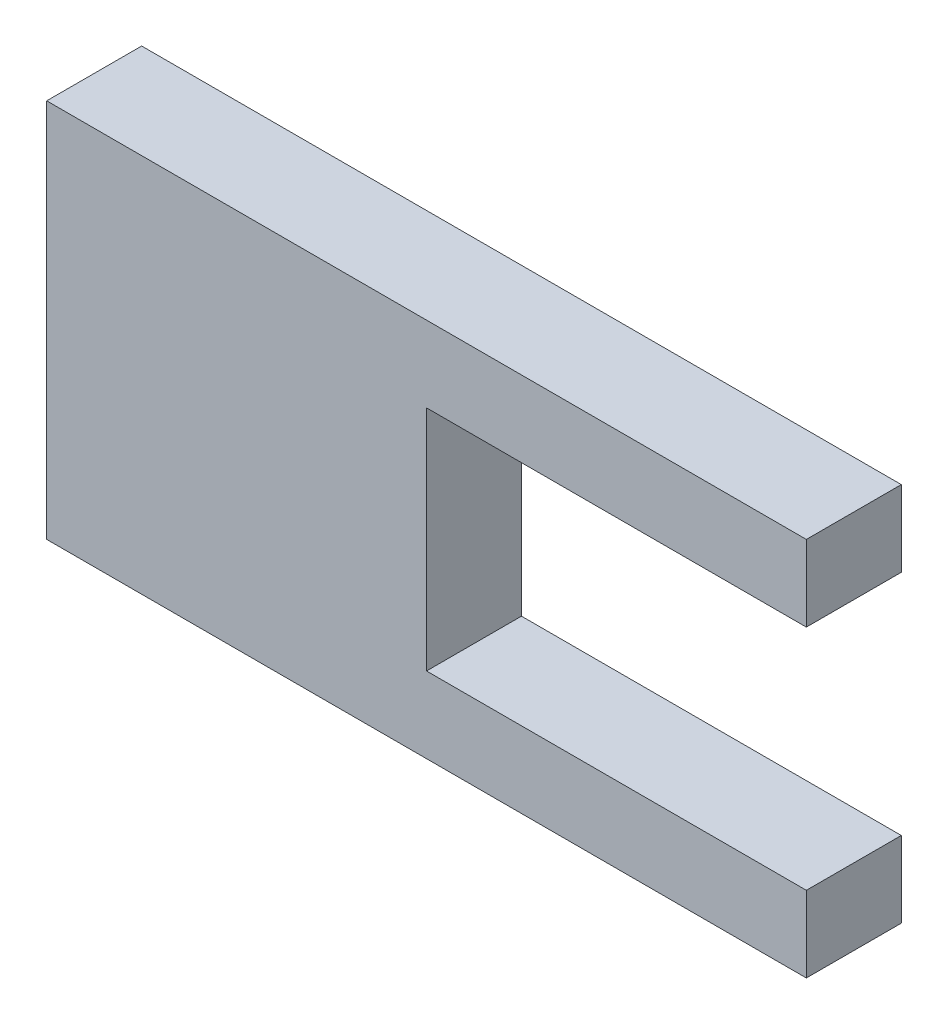
ISO-10303-21;
HEADER;
FILE_DESCRIPTION(('STEP AP214'),'2;1');
FILE_NAME('part.step','',(''),(''),'','','');
FILE_SCHEMA(('AUTOMOTIVE_DESIGN { 1 0 10303 214 1 1 1 1 }'));
ENDSEC;
DATA;
#1=APPLICATION_CONTEXT('core data for automotive mechanical design processes');
#2=APPLICATION_PROTOCOL_DEFINITION('international standard','automotive_design',2000,#1);
#3=PRODUCT_CONTEXT('',#1,'mechanical');
#4=PRODUCT('Part','Part','',(#3));
#5=PRODUCT_RELATED_PRODUCT_CATEGORY('part','',(#4));
#6=PRODUCT_DEFINITION_FORMATION('','',#4);
#7=PRODUCT_DEFINITION_CONTEXT('part definition',#1,'design');
#8=PRODUCT_DEFINITION('design','',#6,#7);
#9=PRODUCT_DEFINITION_SHAPE('','',#8);
#10=(LENGTH_UNIT() NAMED_UNIT(*) SI_UNIT(.MILLI.,.METRE.));
#11=(NAMED_UNIT(*) PLANE_ANGLE_UNIT() SI_UNIT($,.RADIAN.));
#12=(NAMED_UNIT(*) SI_UNIT($,.STERADIAN.) SOLID_ANGLE_UNIT());
#13=UNCERTAINTY_MEASURE_WITH_UNIT(LENGTH_MEASURE(1.E-05),#10,'distance_accuracy_value','');
#14=(GEOMETRIC_REPRESENTATION_CONTEXT(3) GLOBAL_UNCERTAINTY_ASSIGNED_CONTEXT((#13)) GLOBAL_UNIT_ASSIGNED_CONTEXT((#10,
#11,#12)) REPRESENTATION_CONTEXT('',''));
#15=CARTESIAN_POINT('',(0.,0.,0.));
#16=DIRECTION('',(0.,0.,1.));
#17=DIRECTION('',(1.,0.,0.));
#18=AXIS2_PLACEMENT_3D('',#15,#16,#17);
#19=CARTESIAN_POINT('',(-10.,10.,5.));
#20=DIRECTION('',(0.,-1.,0.));
#21=DIRECTION('',(0.,0.,-1.));
#22=AXIS2_PLACEMENT_3D('',#19,#20,#21);
#23=PLANE('',#22);
#24=DIRECTION('',(-1.,0.,0.));
#25=VECTOR('',#24,1.);
#26=CARTESIAN_POINT('',(-10.,10.,0.));
#27=LINE('',#26,#25);
#28=CARTESIAN_POINT('',(30.,10.,0.));
#29=VERTEX_POINT('',#28);
#30=CARTESIAN_POINT('',(-10.,10.,0.));
#31=VERTEX_POINT('',#30);
#32=EDGE_CURVE('E91',#29,#31,#27,.T.);
#33=ORIENTED_EDGE('',*,*,#32,.T.);
#34=DIRECTION('',(0.,0.,-1.));
#35=VECTOR('',#34,1.);
#36=CARTESIAN_POINT('',(-10.,10.,5.));
#37=LINE('',#36,#35);
#38=CARTESIAN_POINT('',(-10.,10.,5.));
#39=VERTEX_POINT('',#38);
#40=EDGE_CURVE('E11',#39,#31,#37,.T.);
#41=ORIENTED_EDGE('',*,*,#40,.F.);
#42=DIRECTION('',(-1.,0.,0.));
#43=VECTOR('',#42,1.);
#44=CARTESIAN_POINT('',(10.,10.,5.));
#45=LINE('',#44,#43);
#46=CARTESIAN_POINT('',(30.,10.,5.));
#47=VERTEX_POINT('',#46);
#48=EDGE_CURVE('E97',#47,#39,#45,.T.);
#49=ORIENTED_EDGE('',*,*,#48,.F.);
#50=DIRECTION('',(0.,0.,-1.));
#51=VECTOR('',#50,1.);
#52=CARTESIAN_POINT('',(30.,10.,5.));
#53=LINE('',#52,#51);
#54=EDGE_CURVE('E131',#47,#29,#53,.T.);
#55=ORIENTED_EDGE('',*,*,#54,.T.);
#56=EDGE_LOOP('',(#33,#41,#49,#55));
#57=FACE_BOUND('',#56,.T.);
#58=ADVANCED_FACE('F39',(#57),#23,.F.);
#59=CARTESIAN_POINT('',(-10.,-10.,5.));
#60=DIRECTION('',(1.,0.,0.));
#61=DIRECTION('',(0.,0.,-1.));
#62=AXIS2_PLACEMENT_3D('',#59,#60,#61);
#63=PLANE('',#62);
#64=DIRECTION('',(0.,-1.,0.));
#65=VECTOR('',#64,1.);
#66=CARTESIAN_POINT('',(-10.,-10.,0.));
#67=LINE('',#66,#65);
#68=CARTESIAN_POINT('',(-10.,-10.,0.));
#69=VERTEX_POINT('',#68);
#70=EDGE_CURVE('E136',#31,#69,#67,.T.);
#71=ORIENTED_EDGE('',*,*,#70,.T.);
#72=DIRECTION('',(0.,0.,-1.));
#73=VECTOR('',#72,1.);
#74=CARTESIAN_POINT('',(-10.,-10.,5.));
#75=LINE('',#74,#73);
#76=CARTESIAN_POINT('',(-10.,-10.,5.));
#77=VERTEX_POINT('',#76);
#78=EDGE_CURVE('E47',#77,#69,#75,.T.);
#79=ORIENTED_EDGE('',*,*,#78,.F.);
#80=DIRECTION('',(0.,-1.,0.));
#81=VECTOR('',#80,1.);
#82=CARTESIAN_POINT('',(-10.,-10.,5.));
#83=LINE('',#82,#81);
#84=EDGE_CURVE('E168',#39,#77,#83,.T.);
#85=ORIENTED_EDGE('',*,*,#84,.F.);
#86=ORIENTED_EDGE('',*,*,#40,.T.);
#87=EDGE_LOOP('',(#71,#79,#85,#86));
#88=FACE_BOUND('',#87,.T.);
#89=ADVANCED_FACE('F167',(#88),#63,.F.);
#90=CARTESIAN_POINT('',(10.,-10.,5.));
#91=DIRECTION('',(0.,1.,0.));
#92=DIRECTION('',(-1.,0.,0.));
#93=AXIS2_PLACEMENT_3D('',#90,#91,#92);
#94=PLANE('',#93);
#95=DIRECTION('',(1.,0.,0.));
#96=VECTOR('',#95,1.);
#97=CARTESIAN_POINT('',(10.,-10.,0.));
#98=LINE('',#97,#96);
#99=CARTESIAN_POINT('',(30.,-10.,0.));
#100=VERTEX_POINT('',#99);
#101=EDGE_CURVE('E139',#69,#100,#98,.T.);
#102=ORIENTED_EDGE('',*,*,#101,.T.);
#103=DIRECTION('',(0.,0.,-1.));
#104=VECTOR('',#103,1.);
#105=CARTESIAN_POINT('',(30.,-10.,5.));
#106=LINE('',#105,#104);
#107=CARTESIAN_POINT('',(30.,-10.,5.));
#108=VERTEX_POINT('',#107);
#109=EDGE_CURVE('E156',#108,#100,#106,.T.);
#110=ORIENTED_EDGE('',*,*,#109,.F.);
#111=DIRECTION('',(1.,0.,0.));
#112=VECTOR('',#111,1.);
#113=CARTESIAN_POINT('',(-10.,-10.,5.));
#114=LINE('',#113,#112);
#115=EDGE_CURVE('E164',#77,#108,#114,.T.);
#116=ORIENTED_EDGE('',*,*,#115,.F.);
#117=ORIENTED_EDGE('',*,*,#78,.T.);
#118=EDGE_LOOP('',(#102,#110,#116,#117));
#119=FACE_BOUND('',#118,.T.);
#120=ADVANCED_FACE('F162',(#119),#94,.F.);
#121=CARTESIAN_POINT('',(30.,-10.,5.));
#122=DIRECTION('',(-1.,0.,0.));
#123=DIRECTION('',(0.,0.,1.));
#124=AXIS2_PLACEMENT_3D('',#121,#122,#123);
#125=PLANE('',#124);
#126=DIRECTION('',(0.,1.,0.));
#127=VECTOR('',#126,1.);
#128=CARTESIAN_POINT('',(30.,-10.,0.));
#129=LINE('',#128,#127);
#130=CARTESIAN_POINT('',(30.,-6.,0.));
#131=VERTEX_POINT('',#130);
#132=EDGE_CURVE('E141',#100,#131,#129,.T.);
#133=ORIENTED_EDGE('',*,*,#132,.T.);
#134=DIRECTION('',(0.,0.,-1.));
#135=VECTOR('',#134,1.);
#136=CARTESIAN_POINT('',(30.,-6.,5.));
#137=LINE('',#136,#135);
#138=CARTESIAN_POINT('',(30.,-6.,5.));
#139=VERTEX_POINT('',#138);
#140=EDGE_CURVE('E153',#139,#131,#137,.T.);
#141=ORIENTED_EDGE('',*,*,#140,.F.);
#142=DIRECTION('',(0.,1.,0.));
#143=VECTOR('',#142,1.);
#144=CARTESIAN_POINT('',(30.,-10.,5.));
#145=LINE('',#144,#143);
#146=EDGE_CURVE('E178',#108,#139,#145,.T.);
#147=ORIENTED_EDGE('',*,*,#146,.F.);
#148=ORIENTED_EDGE('',*,*,#109,.T.);
#149=EDGE_LOOP('',(#133,#141,#147,#148));
#150=FACE_BOUND('',#149,.T.);
#151=ADVANCED_FACE('F174',(#150),#125,.F.);
#152=CARTESIAN_POINT('',(10.,-6.,5.));
#153=DIRECTION('',(0.,-1.,0.));
#154=DIRECTION('',(1.,0.,0.));
#155=AXIS2_PLACEMENT_3D('',#152,#153,#154);
#156=PLANE('',#155);
#157=DIRECTION('',(-1.,0.,0.));
#158=VECTOR('',#157,1.);
#159=CARTESIAN_POINT('',(10.,-6.,0.));
#160=LINE('',#159,#158);
#161=CARTESIAN_POINT('',(10.,-6.,0.));
#162=VERTEX_POINT('',#161);
#163=EDGE_CURVE('E143',#131,#162,#160,.T.);
#164=ORIENTED_EDGE('',*,*,#163,.T.);
#165=DIRECTION('',(0.,0.,-1.));
#166=VECTOR('',#165,1.);
#167=CARTESIAN_POINT('',(10.,-6.,5.));
#168=LINE('',#167,#166);
#169=CARTESIAN_POINT('',(10.,-6.,5.));
#170=VERTEX_POINT('',#169);
#171=EDGE_CURVE('E126',#170,#162,#168,.T.);
#172=ORIENTED_EDGE('',*,*,#171,.F.);
#173=DIRECTION('',(-1.,0.,0.));
#174=VECTOR('',#173,1.);
#175=CARTESIAN_POINT('',(10.,-6.,5.));
#176=LINE('',#175,#174);
#177=EDGE_CURVE('E117',#139,#170,#176,.T.);
#178=ORIENTED_EDGE('',*,*,#177,.F.);
#179=ORIENTED_EDGE('',*,*,#140,.T.);
#180=EDGE_LOOP('',(#164,#172,#178,#179));
#181=FACE_BOUND('',#180,.T.);
#182=ADVANCED_FACE('F177',(#181),#156,.F.);
#183=CARTESIAN_POINT('',(10.,-6.,5.));
#184=DIRECTION('',(-1.,0.,0.));
#185=DIRECTION('',(0.,-1.,0.));
#186=AXIS2_PLACEMENT_3D('',#183,#184,#185);
#187=PLANE('',#186);
#188=DIRECTION('',(0.,1.,0.));
#189=VECTOR('',#188,1.);
#190=CARTESIAN_POINT('',(10.,-6.,0.));
#191=LINE('',#190,#189);
#192=CARTESIAN_POINT('',(10.,6.,0.));
#193=VERTEX_POINT('',#192);
#194=EDGE_CURVE('E125',#162,#193,#191,.T.);
#195=ORIENTED_EDGE('',*,*,#194,.T.);
#196=DIRECTION('',(0.,0.,-1.));
#197=VECTOR('',#196,1.);
#198=CARTESIAN_POINT('',(10.,6.,5.));
#199=LINE('',#198,#197);
#200=CARTESIAN_POINT('',(10.,6.,5.));
#201=VERTEX_POINT('',#200);
#202=EDGE_CURVE('E122',#201,#193,#199,.T.);
#203=ORIENTED_EDGE('',*,*,#202,.F.);
#204=DIRECTION('',(0.,1.,0.));
#205=VECTOR('',#204,1.);
#206=CARTESIAN_POINT('',(10.,-6.,5.));
#207=LINE('',#206,#205);
#208=EDGE_CURVE('E111',#170,#201,#207,.T.);
#209=ORIENTED_EDGE('',*,*,#208,.F.);
#210=ORIENTED_EDGE('',*,*,#171,.T.);
#211=EDGE_LOOP('',(#195,#203,#209,#210));
#212=FACE_BOUND('',#211,.T.);
#213=ADVANCED_FACE('F123',(#212),#187,.F.);
#214=CARTESIAN_POINT('',(10.,6.,5.));
#215=DIRECTION('',(0.,1.,0.));
#216=DIRECTION('',(-1.,0.,0.));
#217=AXIS2_PLACEMENT_3D('',#214,#215,#216);
#218=PLANE('',#217);
#219=DIRECTION('',(1.,0.,0.));
#220=VECTOR('',#219,1.);
#221=CARTESIAN_POINT('',(10.,6.,0.));
#222=LINE('',#221,#220);
#223=CARTESIAN_POINT('',(30.,6.00000000000001,0.));
#224=VERTEX_POINT('',#223);
#225=EDGE_CURVE('E84',#193,#224,#222,.T.);
#226=ORIENTED_EDGE('',*,*,#225,.T.);
#227=DIRECTION('',(0.,0.,-1.));
#228=VECTOR('',#227,1.);
#229=CARTESIAN_POINT('',(30.,6.00000000000001,5.));
#230=LINE('',#229,#228);
#231=CARTESIAN_POINT('',(30.,6.00000000000001,5.));
#232=VERTEX_POINT('',#231);
#233=EDGE_CURVE('E127',#232,#224,#230,.T.);
#234=ORIENTED_EDGE('',*,*,#233,.F.);
#235=DIRECTION('',(1.,0.,0.));
#236=VECTOR('',#235,1.);
#237=CARTESIAN_POINT('',(10.,6.,5.));
#238=LINE('',#237,#236);
#239=EDGE_CURVE('E115',#201,#232,#238,.T.);
#240=ORIENTED_EDGE('',*,*,#239,.F.);
#241=ORIENTED_EDGE('',*,*,#202,.T.);
#242=EDGE_LOOP('',(#226,#234,#240,#241));
#243=FACE_BOUND('',#242,.T.);
#244=ADVANCED_FACE('F129',(#243),#218,.F.);
#245=CARTESIAN_POINT('',(30.,10.,5.));
#246=DIRECTION('',(-1.,0.,0.));
#247=DIRECTION('',(0.,0.,1.));
#248=AXIS2_PLACEMENT_3D('',#245,#246,#247);
#249=PLANE('',#248);
#250=DIRECTION('',(0.,1.,0.));
#251=VECTOR('',#250,1.);
#252=CARTESIAN_POINT('',(30.,10.,0.));
#253=LINE('',#252,#251);
#254=EDGE_CURVE('E147',#224,#29,#253,.T.);
#255=ORIENTED_EDGE('',*,*,#254,.T.);
#256=ORIENTED_EDGE('',*,*,#54,.F.);
#257=DIRECTION('',(0.,1.,0.));
#258=VECTOR('',#257,1.);
#259=CARTESIAN_POINT('',(30.,10.,5.));
#260=LINE('',#259,#258);
#261=EDGE_CURVE('E55',#232,#47,#260,.T.);
#262=ORIENTED_EDGE('',*,*,#261,.F.);
#263=ORIENTED_EDGE('',*,*,#233,.T.);
#264=EDGE_LOOP('',(#255,#256,#262,#263));
#265=FACE_BOUND('',#264,.T.);
#266=ADVANCED_FACE('F184',(#265),#249,.F.);
#267=CARTESIAN_POINT('',(0.,0.,5.));
#268=DIRECTION('',(0.,0.,-1.));
#269=DIRECTION('',(-1.,0.,0.));
#270=AXIS2_PLACEMENT_3D('',#267,#268,#269);
#271=PLANE('',#270);
#272=ORIENTED_EDGE('',*,*,#48,.T.);
#273=ORIENTED_EDGE('',*,*,#84,.T.);
#274=ORIENTED_EDGE('',*,*,#115,.T.);
#275=ORIENTED_EDGE('',*,*,#146,.T.);
#276=ORIENTED_EDGE('',*,*,#177,.T.);
#277=ORIENTED_EDGE('',*,*,#208,.T.);
#278=ORIENTED_EDGE('',*,*,#239,.T.);
#279=ORIENTED_EDGE('',*,*,#261,.T.);
#280=EDGE_LOOP('',(#272,#273,#274,#275,#276,#277,#278,#279));
#281=FACE_BOUND('',#280,.T.);
#282=ADVANCED_FACE('F113',(#281),#271,.F.);
#283=CARTESIAN_POINT('',(0.,0.,0.));
#284=DIRECTION('',(0.,0.,-1.));
#285=DIRECTION('',(-1.,0.,0.));
#286=AXIS2_PLACEMENT_3D('',#283,#284,#285);
#287=PLANE('',#286);
#288=ORIENTED_EDGE('',*,*,#32,.F.);
#289=ORIENTED_EDGE('',*,*,#254,.F.);
#290=ORIENTED_EDGE('',*,*,#225,.F.);
#291=ORIENTED_EDGE('',*,*,#194,.F.);
#292=ORIENTED_EDGE('',*,*,#163,.F.);
#293=ORIENTED_EDGE('',*,*,#132,.F.);
#294=ORIENTED_EDGE('',*,*,#101,.F.);
#295=ORIENTED_EDGE('',*,*,#70,.F.);
#296=EDGE_LOOP('',(#288,#289,#290,#291,#292,#293,#294,#295));
#297=FACE_BOUND('',#296,.T.);
#298=ADVANCED_FACE('F169',(#297),#287,.T.);
#299=CLOSED_SHELL('',(#58,#89,#120,#151,#182,#213,#244,#266,#282,#298));
#300=MANIFOLD_SOLID_BREP('B2',#299);
#301=ADVANCED_BREP_SHAPE_REPRESENTATION('',(#18,#300),#14);
#302=SHAPE_DEFINITION_REPRESENTATION(#9,#301);
ENDSEC;
END-ISO-10303-21;
